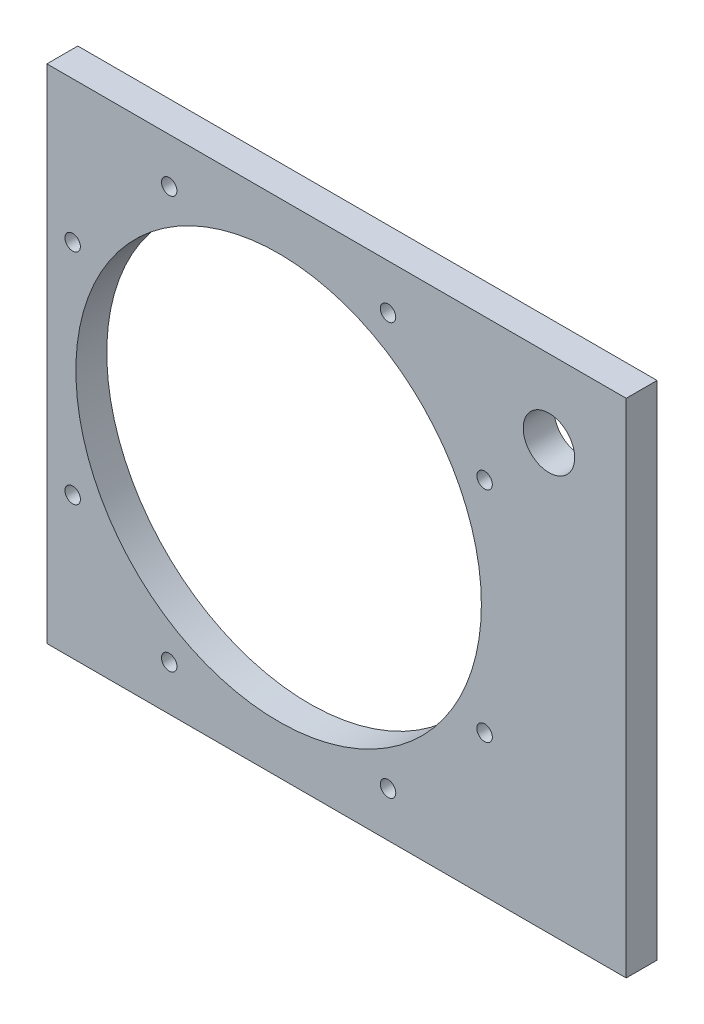
ISO-10303-21;
HEADER;
FILE_DESCRIPTION(('STEP AP214'),'2;1');
FILE_NAME('part.step','',(''),(''),'','','');
FILE_SCHEMA(('AUTOMOTIVE_DESIGN { 1 0 10303 214 1 1 1 1 }'));
ENDSEC;
DATA;
#1=APPLICATION_CONTEXT('core data for automotive mechanical design processes');
#2=APPLICATION_PROTOCOL_DEFINITION('international standard','automotive_design',2000,#1);
#3=PRODUCT_CONTEXT('',#1,'mechanical');
#4=PRODUCT('Part','Part','',(#3));
#5=PRODUCT_RELATED_PRODUCT_CATEGORY('part','',(#4));
#6=PRODUCT_DEFINITION_FORMATION('','',#4);
#7=PRODUCT_DEFINITION_CONTEXT('part definition',#1,'design');
#8=PRODUCT_DEFINITION('design','',#6,#7);
#9=PRODUCT_DEFINITION_SHAPE('','',#8);
#10=(LENGTH_UNIT() NAMED_UNIT(*) SI_UNIT(.MILLI.,.METRE.));
#11=(NAMED_UNIT(*) PLANE_ANGLE_UNIT() SI_UNIT($,.RADIAN.));
#12=(NAMED_UNIT(*) SI_UNIT($,.STERADIAN.) SOLID_ANGLE_UNIT());
#13=UNCERTAINTY_MEASURE_WITH_UNIT(LENGTH_MEASURE(1.E-05),#10,'distance_accuracy_value','');
#14=(GEOMETRIC_REPRESENTATION_CONTEXT(3) GLOBAL_UNCERTAINTY_ASSIGNED_CONTEXT((#13)) GLOBAL_UNIT_ASSIGNED_CONTEXT((#10,
#11,#12)) REPRESENTATION_CONTEXT('',''));
#15=CARTESIAN_POINT('',(0.,0.,0.));
#16=DIRECTION('',(0.,0.,1.));
#17=DIRECTION('',(1.,0.,0.));
#18=AXIS2_PLACEMENT_3D('',#15,#16,#17);
#19=CARTESIAN_POINT('',(0.,0.,24.));
#20=DIRECTION('',(0.,0.,1.));
#21=DIRECTION('',(1.,0.,0.));
#22=AXIS2_PLACEMENT_3D('',#19,#20,#21);
#23=PLANE('',#22);
#24=CARTESIAN_POINT('',(40.0000000000018,-160.,24.));
#25=DIRECTION('',(0.,0.,1.));
#26=DIRECTION('',(-1.,0.,0.));
#27=AXIS2_PLACEMENT_3D('',#24,#25,#26);
#28=CIRCLE('',#27,6.00000000000001);
#29=CARTESIAN_POINT('',(34.0000000000017,-160.,24.));
#30=VERTEX_POINT('',#29);
#31=EDGE_CURVE('E161',#30,#30,#28,.T.);
#32=ORIENTED_EDGE('',*,*,#31,.F.);
#33=EDGE_LOOP('',(#32));
#34=FACE_BOUND('',#33,.T.);
#35=CARTESIAN_POINT('',(115.000000000003,85.0000000000034,24.));
#36=DIRECTION('',(0.,0.,1.));
#37=DIRECTION('',(-1.,0.,0.));
#38=AXIS2_PLACEMENT_3D('',#35,#36,#37);
#39=CIRCLE('',#38,6.);
#40=CARTESIAN_POINT('',(109.000000000003,85.0000000000034,24.));
#41=VERTEX_POINT('',#40);
#42=EDGE_CURVE('E149',#41,#41,#39,.T.);
#43=ORIENTED_EDGE('',*,*,#42,.F.);
#44=EDGE_LOOP('',(#43));
#45=FACE_BOUND('',#44,.T.);
#46=CARTESIAN_POINT('',(-130.000000000001,160.000000000004,24.));
#47=DIRECTION('',(0.,0.,1.));
#48=DIRECTION('',(-1.,0.,0.));
#49=AXIS2_PLACEMENT_3D('',#46,#47,#48);
#50=CIRCLE('',#49,6.00000000000002);
#51=CARTESIAN_POINT('',(-136.000000000001,160.000000000004,24.));
#52=VERTEX_POINT('',#51);
#53=EDGE_CURVE('E137',#52,#52,#50,.T.);
#54=ORIENTED_EDGE('',*,*,#53,.F.);
#55=EDGE_LOOP('',(#54));
#56=FACE_BOUND('',#55,.T.);
#57=CARTESIAN_POINT('',(-205.,-85.0000000000001,24.));
#58=DIRECTION('',(0.,0.,1.));
#59=DIRECTION('',(-1.,0.,0.));
#60=AXIS2_PLACEMENT_3D('',#57,#58,#59);
#61=CIRCLE('',#60,6.00000000000002);
#62=CARTESIAN_POINT('',(-211.,-85.0000000000001,24.));
#63=VERTEX_POINT('',#62);
#64=EDGE_CURVE('E125',#63,#63,#61,.T.);
#65=ORIENTED_EDGE('',*,*,#64,.F.);
#66=EDGE_LOOP('',(#65));
#67=FACE_BOUND('',#66,.T.);
#68=CARTESIAN_POINT('',(-45.,0.,24.));
#69=DIRECTION('',(0.,0.,1.));
#70=DIRECTION('',(1.,0.,0.));
#71=AXIS2_PLACEMENT_3D('',#68,#69,#70);
#72=CIRCLE('',#71,157.5);
#73=CARTESIAN_POINT('',(112.5,0.,24.));
#74=VERTEX_POINT('',#73);
#75=EDGE_CURVE('E104',#74,#74,#72,.T.);
#76=ORIENTED_EDGE('',*,*,#75,.F.);
#77=EDGE_LOOP('',(#76));
#78=FACE_BOUND('',#77,.T.);
#79=DIRECTION('',(0.,1.,0.));
#80=VECTOR('',#79,1.);
#81=CARTESIAN_POINT('',(225.,195.,24.));
#82=LINE('',#81,#80);
#83=CARTESIAN_POINT('',(225.,-195.,24.));
#84=VERTEX_POINT('',#83);
#85=CARTESIAN_POINT('',(225.,195.,24.));
#86=VERTEX_POINT('',#85);
#87=EDGE_CURVE('E89',#84,#86,#82,.T.);
#88=ORIENTED_EDGE('',*,*,#87,.T.);
#89=DIRECTION('',(-1.,0.,0.));
#90=VECTOR('',#89,1.);
#91=CARTESIAN_POINT('',(-225.,195.,24.));
#92=LINE('',#91,#90);
#93=CARTESIAN_POINT('',(-225.,195.,24.));
#94=VERTEX_POINT('',#93);
#95=EDGE_CURVE('E84',#86,#94,#92,.T.);
#96=ORIENTED_EDGE('',*,*,#95,.T.);
#97=DIRECTION('',(0.,-1.,0.));
#98=VECTOR('',#97,1.);
#99=CARTESIAN_POINT('',(-225.,195.,24.));
#100=LINE('',#99,#98);
#101=CARTESIAN_POINT('',(-225.,-195.,24.));
#102=VERTEX_POINT('',#101);
#103=EDGE_CURVE('E87',#94,#102,#100,.T.);
#104=ORIENTED_EDGE('',*,*,#103,.T.);
#105=DIRECTION('',(1.,0.,0.));
#106=VECTOR('',#105,1.);
#107=CARTESIAN_POINT('',(-225.,-195.,24.));
#108=LINE('',#107,#106);
#109=EDGE_CURVE('E54',#102,#84,#108,.T.);
#110=ORIENTED_EDGE('',*,*,#109,.T.);
#111=EDGE_LOOP('',(#88,#96,#104,#110));
#112=FACE_BOUND('',#111,.T.);
#113=CARTESIAN_POINT('',(-205.,85.,24.));
#114=DIRECTION('',(0.,0.,1.));
#115=DIRECTION('',(1.,0.,0.));
#116=AXIS2_PLACEMENT_3D('',#113,#114,#115);
#117=CIRCLE('',#116,6.00000000000002);
#118=CARTESIAN_POINT('',(-199.,85.,24.));
#119=VERTEX_POINT('',#118);
#120=EDGE_CURVE('E119',#119,#119,#117,.T.);
#121=ORIENTED_EDGE('',*,*,#120,.F.);
#122=EDGE_LOOP('',(#121));
#123=FACE_BOUND('',#122,.T.);
#124=CARTESIAN_POINT('',(39.9999999999996,160.000000000003,24.));
#125=DIRECTION('',(0.,0.,1.));
#126=DIRECTION('',(1.,0.,0.));
#127=AXIS2_PLACEMENT_3D('',#124,#125,#126);
#128=CIRCLE('',#127,6.00000000000001);
#129=CARTESIAN_POINT('',(45.9999999999996,160.000000000003,24.));
#130=VERTEX_POINT('',#129);
#131=EDGE_CURVE('E131',#130,#130,#128,.T.);
#132=ORIENTED_EDGE('',*,*,#131,.F.);
#133=EDGE_LOOP('',(#132));
#134=FACE_BOUND('',#133,.T.);
#135=CARTESIAN_POINT('',(115.000000000002,-84.9999999999968,24.));
#136=DIRECTION('',(0.,0.,1.));
#137=DIRECTION('',(1.,0.,0.));
#138=AXIS2_PLACEMENT_3D('',#135,#136,#137);
#139=CIRCLE('',#138,6.00000000000003);
#140=CARTESIAN_POINT('',(121.000000000002,-84.9999999999968,24.));
#141=VERTEX_POINT('',#140);
#142=EDGE_CURVE('E143',#141,#141,#139,.T.);
#143=ORIENTED_EDGE('',*,*,#142,.F.);
#144=EDGE_LOOP('',(#143));
#145=FACE_BOUND('',#144,.T.);
#146=CARTESIAN_POINT('',(-129.999999999998,-159.999999999998,24.));
#147=DIRECTION('',(0.,0.,1.));
#148=DIRECTION('',(1.,0.,0.));
#149=AXIS2_PLACEMENT_3D('',#146,#147,#148);
#150=CIRCLE('',#149,6.00000000000002);
#151=CARTESIAN_POINT('',(-123.999999999998,-159.999999999998,24.));
#152=VERTEX_POINT('',#151);
#153=EDGE_CURVE('E155',#152,#152,#150,.T.);
#154=ORIENTED_EDGE('',*,*,#153,.F.);
#155=EDGE_LOOP('',(#154));
#156=FACE_BOUND('',#155,.T.);
#157=CARTESIAN_POINT('',(165.,135.,24.));
#158=DIRECTION('',(0.,0.,1.));
#159=DIRECTION('',(1.,0.,0.));
#160=AXIS2_PLACEMENT_3D('',#157,#158,#159);
#161=CIRCLE('',#160,20.);
#162=CARTESIAN_POINT('',(185.,135.,24.));
#163=VERTEX_POINT('',#162);
#164=EDGE_CURVE('E167',#163,#163,#161,.T.);
#165=ORIENTED_EDGE('',*,*,#164,.F.);
#166=EDGE_LOOP('',(#165));
#167=FACE_BOUND('',#166,.T.);
#168=ADVANCED_FACE('F37',(#34,#45,#56,#67,#78,#112,#123,#134,#145,#156,#167),#23,.T.);
#169=CARTESIAN_POINT('',(0.,0.,0.));
#170=DIRECTION('',(0.,0.,1.));
#171=DIRECTION('',(1.,0.,0.));
#172=AXIS2_PLACEMENT_3D('',#169,#170,#171);
#173=PLANE('',#172);
#174=DIRECTION('',(0.,1.,0.));
#175=VECTOR('',#174,1.);
#176=CARTESIAN_POINT('',(225.,195.,0.));
#177=LINE('',#176,#175);
#178=CARTESIAN_POINT('',(225.,-195.,0.));
#179=VERTEX_POINT('',#178);
#180=CARTESIAN_POINT('',(225.,195.,0.));
#181=VERTEX_POINT('',#180);
#182=EDGE_CURVE('E101',#179,#181,#177,.T.);
#183=ORIENTED_EDGE('',*,*,#182,.F.);
#184=DIRECTION('',(1.,0.,0.));
#185=VECTOR('',#184,1.);
#186=CARTESIAN_POINT('',(-225.,-195.,0.));
#187=LINE('',#186,#185);
#188=CARTESIAN_POINT('',(-225.,-195.,0.));
#189=VERTEX_POINT('',#188);
#190=EDGE_CURVE('E77',#189,#179,#187,.T.);
#191=ORIENTED_EDGE('',*,*,#190,.F.);
#192=DIRECTION('',(0.,-1.,0.));
#193=VECTOR('',#192,1.);
#194=CARTESIAN_POINT('',(-225.,195.,0.));
#195=LINE('',#194,#193);
#196=CARTESIAN_POINT('',(-225.,195.,0.));
#197=VERTEX_POINT('',#196);
#198=EDGE_CURVE('E71',#197,#189,#195,.T.);
#199=ORIENTED_EDGE('',*,*,#198,.F.);
#200=DIRECTION('',(-1.,0.,0.));
#201=VECTOR('',#200,1.);
#202=CARTESIAN_POINT('',(-225.,195.,0.));
#203=LINE('',#202,#201);
#204=EDGE_CURVE('E93',#181,#197,#203,.T.);
#205=ORIENTED_EDGE('',*,*,#204,.F.);
#206=EDGE_LOOP('',(#183,#191,#199,#205));
#207=FACE_BOUND('',#206,.T.);
#208=CARTESIAN_POINT('',(-45.,0.,0.));
#209=DIRECTION('',(0.,0.,1.));
#210=DIRECTION('',(1.,0.,0.));
#211=AXIS2_PLACEMENT_3D('',#208,#209,#210);
#212=CIRCLE('',#211,157.5);
#213=CARTESIAN_POINT('',(112.5,0.,0.));
#214=VERTEX_POINT('',#213);
#215=EDGE_CURVE('E116',#214,#214,#212,.T.);
#216=ORIENTED_EDGE('',*,*,#215,.T.);
#217=EDGE_LOOP('',(#216));
#218=FACE_BOUND('',#217,.T.);
#219=CARTESIAN_POINT('',(-205.,85.,0.));
#220=DIRECTION('',(0.,0.,1.));
#221=DIRECTION('',(1.,0.,0.));
#222=AXIS2_PLACEMENT_3D('',#219,#220,#221);
#223=CIRCLE('',#222,6.00000000000002);
#224=CARTESIAN_POINT('',(-199.,85.,0.));
#225=VERTEX_POINT('',#224);
#226=EDGE_CURVE('E122',#225,#225,#223,.T.);
#227=ORIENTED_EDGE('',*,*,#226,.T.);
#228=EDGE_LOOP('',(#227));
#229=FACE_BOUND('',#228,.T.);
#230=CARTESIAN_POINT('',(-205.,-85.0000000000001,0.));
#231=DIRECTION('',(0.,0.,1.));
#232=DIRECTION('',(-1.,0.,0.));
#233=AXIS2_PLACEMENT_3D('',#230,#231,#232);
#234=CIRCLE('',#233,6.00000000000002);
#235=CARTESIAN_POINT('',(-211.,-85.0000000000001,0.));
#236=VERTEX_POINT('',#235);
#237=EDGE_CURVE('E128',#236,#236,#234,.T.);
#238=ORIENTED_EDGE('',*,*,#237,.T.);
#239=EDGE_LOOP('',(#238));
#240=FACE_BOUND('',#239,.T.);
#241=CARTESIAN_POINT('',(39.9999999999996,160.000000000003,0.));
#242=DIRECTION('',(0.,0.,1.));
#243=DIRECTION('',(1.,0.,0.));
#244=AXIS2_PLACEMENT_3D('',#241,#242,#243);
#245=CIRCLE('',#244,6.00000000000001);
#246=CARTESIAN_POINT('',(45.9999999999996,160.000000000003,0.));
#247=VERTEX_POINT('',#246);
#248=EDGE_CURVE('E134',#247,#247,#245,.T.);
#249=ORIENTED_EDGE('',*,*,#248,.T.);
#250=EDGE_LOOP('',(#249));
#251=FACE_BOUND('',#250,.T.);
#252=CARTESIAN_POINT('',(-130.000000000001,160.000000000004,0.));
#253=DIRECTION('',(0.,0.,1.));
#254=DIRECTION('',(-1.,0.,0.));
#255=AXIS2_PLACEMENT_3D('',#252,#253,#254);
#256=CIRCLE('',#255,6.00000000000002);
#257=CARTESIAN_POINT('',(-136.000000000001,160.000000000004,0.));
#258=VERTEX_POINT('',#257);
#259=EDGE_CURVE('E140',#258,#258,#256,.T.);
#260=ORIENTED_EDGE('',*,*,#259,.T.);
#261=EDGE_LOOP('',(#260));
#262=FACE_BOUND('',#261,.T.);
#263=CARTESIAN_POINT('',(115.000000000002,-84.9999999999968,0.));
#264=DIRECTION('',(0.,0.,1.));
#265=DIRECTION('',(1.,0.,0.));
#266=AXIS2_PLACEMENT_3D('',#263,#264,#265);
#267=CIRCLE('',#266,6.00000000000003);
#268=CARTESIAN_POINT('',(121.000000000002,-84.9999999999968,0.));
#269=VERTEX_POINT('',#268);
#270=EDGE_CURVE('E146',#269,#269,#267,.T.);
#271=ORIENTED_EDGE('',*,*,#270,.T.);
#272=EDGE_LOOP('',(#271));
#273=FACE_BOUND('',#272,.T.);
#274=CARTESIAN_POINT('',(115.000000000003,85.0000000000034,0.));
#275=DIRECTION('',(0.,0.,1.));
#276=DIRECTION('',(-1.,0.,0.));
#277=AXIS2_PLACEMENT_3D('',#274,#275,#276);
#278=CIRCLE('',#277,6.);
#279=CARTESIAN_POINT('',(109.000000000003,85.0000000000034,0.));
#280=VERTEX_POINT('',#279);
#281=EDGE_CURVE('E152',#280,#280,#278,.T.);
#282=ORIENTED_EDGE('',*,*,#281,.T.);
#283=EDGE_LOOP('',(#282));
#284=FACE_BOUND('',#283,.T.);
#285=CARTESIAN_POINT('',(-129.999999999998,-159.999999999998,0.));
#286=DIRECTION('',(0.,0.,1.));
#287=DIRECTION('',(1.,0.,0.));
#288=AXIS2_PLACEMENT_3D('',#285,#286,#287);
#289=CIRCLE('',#288,6.00000000000002);
#290=CARTESIAN_POINT('',(-123.999999999998,-159.999999999998,0.));
#291=VERTEX_POINT('',#290);
#292=EDGE_CURVE('E158',#291,#291,#289,.T.);
#293=ORIENTED_EDGE('',*,*,#292,.T.);
#294=EDGE_LOOP('',(#293));
#295=FACE_BOUND('',#294,.T.);
#296=CARTESIAN_POINT('',(40.0000000000018,-160.,0.));
#297=DIRECTION('',(0.,0.,1.));
#298=DIRECTION('',(-1.,0.,0.));
#299=AXIS2_PLACEMENT_3D('',#296,#297,#298);
#300=CIRCLE('',#299,6.00000000000001);
#301=CARTESIAN_POINT('',(34.0000000000017,-160.,0.));
#302=VERTEX_POINT('',#301);
#303=EDGE_CURVE('E164',#302,#302,#300,.T.);
#304=ORIENTED_EDGE('',*,*,#303,.T.);
#305=EDGE_LOOP('',(#304));
#306=FACE_BOUND('',#305,.T.);
#307=CARTESIAN_POINT('',(165.,135.,0.));
#308=DIRECTION('',(0.,0.,1.));
#309=DIRECTION('',(1.,0.,0.));
#310=AXIS2_PLACEMENT_3D('',#307,#308,#309);
#311=CIRCLE('',#310,20.);
#312=CARTESIAN_POINT('',(185.,135.,0.));
#313=VERTEX_POINT('',#312);
#314=EDGE_CURVE('E170',#313,#313,#311,.T.);
#315=ORIENTED_EDGE('',*,*,#314,.T.);
#316=EDGE_LOOP('',(#315));
#317=FACE_BOUND('',#316,.T.);
#318=ADVANCED_FACE('F112',(#207,#218,#229,#240,#251,#262,#273,#284,#295,#306,#317),#173,.F.);
#319=CARTESIAN_POINT('',(225.,195.,24.));
#320=DIRECTION('',(-1.,0.,0.));
#321=DIRECTION('',(0.,-1.,0.));
#322=AXIS2_PLACEMENT_3D('',#319,#320,#321);
#323=PLANE('',#322);
#324=ORIENTED_EDGE('',*,*,#182,.T.);
#325=DIRECTION('',(0.,0.,-1.));
#326=VECTOR('',#325,1.);
#327=CARTESIAN_POINT('',(225.,195.,24.));
#328=LINE('',#327,#326);
#329=EDGE_CURVE('E11',#86,#181,#328,.T.);
#330=ORIENTED_EDGE('',*,*,#329,.F.);
#331=ORIENTED_EDGE('',*,*,#87,.F.);
#332=DIRECTION('',(0.,0.,-1.));
#333=VECTOR('',#332,1.);
#334=CARTESIAN_POINT('',(225.,-195.,24.));
#335=LINE('',#334,#333);
#336=EDGE_CURVE('E97',#84,#179,#335,.T.);
#337=ORIENTED_EDGE('',*,*,#336,.T.);
#338=EDGE_LOOP('',(#324,#330,#331,#337));
#339=FACE_BOUND('',#338,.T.);
#340=ADVANCED_FACE('F39',(#339),#323,.F.);
#341=CARTESIAN_POINT('',(-225.,195.,24.));
#342=DIRECTION('',(0.,-1.,0.));
#343=DIRECTION('',(0.,0.,-1.));
#344=AXIS2_PLACEMENT_3D('',#341,#342,#343);
#345=PLANE('',#344);
#346=ORIENTED_EDGE('',*,*,#204,.T.);
#347=DIRECTION('',(0.,0.,-1.));
#348=VECTOR('',#347,1.);
#349=CARTESIAN_POINT('',(-225.,195.,24.));
#350=LINE('',#349,#348);
#351=EDGE_CURVE('E46',#94,#197,#350,.T.);
#352=ORIENTED_EDGE('',*,*,#351,.F.);
#353=ORIENTED_EDGE('',*,*,#95,.F.);
#354=ORIENTED_EDGE('',*,*,#329,.T.);
#355=EDGE_LOOP('',(#346,#352,#353,#354));
#356=FACE_BOUND('',#355,.T.);
#357=ADVANCED_FACE('F92',(#356),#345,.F.);
#358=CARTESIAN_POINT('',(-225.,195.,24.));
#359=DIRECTION('',(1.,0.,0.));
#360=DIRECTION('',(0.,1.,0.));
#361=AXIS2_PLACEMENT_3D('',#358,#359,#360);
#362=PLANE('',#361);
#363=ORIENTED_EDGE('',*,*,#198,.T.);
#364=DIRECTION('',(0.,0.,-1.));
#365=VECTOR('',#364,1.);
#366=CARTESIAN_POINT('',(-225.,-195.,24.));
#367=LINE('',#366,#365);
#368=EDGE_CURVE('E94',#102,#189,#367,.T.);
#369=ORIENTED_EDGE('',*,*,#368,.F.);
#370=ORIENTED_EDGE('',*,*,#103,.F.);
#371=ORIENTED_EDGE('',*,*,#351,.T.);
#372=EDGE_LOOP('',(#363,#369,#370,#371));
#373=FACE_BOUND('',#372,.T.);
#374=ADVANCED_FACE('F95',(#373),#362,.F.);
#375=CARTESIAN_POINT('',(-225.,-195.,24.));
#376=DIRECTION('',(0.,1.,0.));
#377=DIRECTION('',(0.,0.,1.));
#378=AXIS2_PLACEMENT_3D('',#375,#376,#377);
#379=PLANE('',#378);
#380=ORIENTED_EDGE('',*,*,#190,.T.);
#381=ORIENTED_EDGE('',*,*,#336,.F.);
#382=ORIENTED_EDGE('',*,*,#109,.F.);
#383=ORIENTED_EDGE('',*,*,#368,.T.);
#384=EDGE_LOOP('',(#380,#381,#382,#383));
#385=FACE_BOUND('',#384,.T.);
#386=ADVANCED_FACE('F109',(#385),#379,.F.);
#387=CARTESIAN_POINT('',(-45.,0.,24.));
#388=DIRECTION('',(0.,0.,-1.));
#389=DIRECTION('',(-1.,0.,0.));
#390=AXIS2_PLACEMENT_3D('',#387,#388,#389);
#391=CYLINDRICAL_SURFACE('',#390,157.5);
#392=ORIENTED_EDGE('',*,*,#75,.T.);
#393=EDGE_LOOP('',(#392));
#394=FACE_BOUND('',#393,.T.);
#395=ORIENTED_EDGE('',*,*,#215,.F.);
#396=EDGE_LOOP('',(#395));
#397=FACE_BOUND('',#396,.T.);
#398=ADVANCED_FACE('F189',(#394,#397),#391,.F.);
#399=CARTESIAN_POINT('',(-205.,85.,24.));
#400=DIRECTION('',(0.,0.,-1.));
#401=DIRECTION('',(-1.,0.,0.));
#402=AXIS2_PLACEMENT_3D('',#399,#400,#401);
#403=CYLINDRICAL_SURFACE('',#402,6.00000000000002);
#404=ORIENTED_EDGE('',*,*,#120,.T.);
#405=EDGE_LOOP('',(#404));
#406=FACE_BOUND('',#405,.T.);
#407=ORIENTED_EDGE('',*,*,#226,.F.);
#408=EDGE_LOOP('',(#407));
#409=FACE_BOUND('',#408,.T.);
#410=ADVANCED_FACE('F235',(#406,#409),#403,.F.);
#411=CARTESIAN_POINT('',(-205.,-85.0000000000001,24.));
#412=DIRECTION('',(0.,0.,-1.));
#413=DIRECTION('',(-1.,0.,0.));
#414=AXIS2_PLACEMENT_3D('',#411,#412,#413);
#415=CYLINDRICAL_SURFACE('',#414,6.00000000000002);
#416=ORIENTED_EDGE('',*,*,#64,.T.);
#417=EDGE_LOOP('',(#416));
#418=FACE_BOUND('',#417,.T.);
#419=ORIENTED_EDGE('',*,*,#237,.F.);
#420=EDGE_LOOP('',(#419));
#421=FACE_BOUND('',#420,.T.);
#422=ADVANCED_FACE('F243',(#418,#421),#415,.F.);
#423=CARTESIAN_POINT('',(39.9999999999996,160.000000000003,24.));
#424=DIRECTION('',(0.,0.,-1.));
#425=DIRECTION('',(-1.,0.,0.));
#426=AXIS2_PLACEMENT_3D('',#423,#424,#425);
#427=CYLINDRICAL_SURFACE('',#426,6.00000000000001);
#428=ORIENTED_EDGE('',*,*,#131,.T.);
#429=EDGE_LOOP('',(#428));
#430=FACE_BOUND('',#429,.T.);
#431=ORIENTED_EDGE('',*,*,#248,.F.);
#432=EDGE_LOOP('',(#431));
#433=FACE_BOUND('',#432,.T.);
#434=ADVANCED_FACE('F251',(#430,#433),#427,.F.);
#435=CARTESIAN_POINT('',(-130.000000000001,160.000000000004,24.));
#436=DIRECTION('',(0.,0.,-1.));
#437=DIRECTION('',(-1.,0.,0.));
#438=AXIS2_PLACEMENT_3D('',#435,#436,#437);
#439=CYLINDRICAL_SURFACE('',#438,6.00000000000002);
#440=ORIENTED_EDGE('',*,*,#53,.T.);
#441=EDGE_LOOP('',(#440));
#442=FACE_BOUND('',#441,.T.);
#443=ORIENTED_EDGE('',*,*,#259,.F.);
#444=EDGE_LOOP('',(#443));
#445=FACE_BOUND('',#444,.T.);
#446=ADVANCED_FACE('F260',(#442,#445),#439,.F.);
#447=CARTESIAN_POINT('',(115.000000000002,-84.9999999999968,24.));
#448=DIRECTION('',(0.,0.,-1.));
#449=DIRECTION('',(-1.,0.,0.));
#450=AXIS2_PLACEMENT_3D('',#447,#448,#449);
#451=CYLINDRICAL_SURFACE('',#450,6.00000000000003);
#452=ORIENTED_EDGE('',*,*,#142,.T.);
#453=EDGE_LOOP('',(#452));
#454=FACE_BOUND('',#453,.T.);
#455=ORIENTED_EDGE('',*,*,#270,.F.);
#456=EDGE_LOOP('',(#455));
#457=FACE_BOUND('',#456,.T.);
#458=ADVANCED_FACE('F269',(#454,#457),#451,.F.);
#459=CARTESIAN_POINT('',(115.000000000003,85.0000000000034,24.));
#460=DIRECTION('',(0.,0.,-1.));
#461=DIRECTION('',(-1.,0.,0.));
#462=AXIS2_PLACEMENT_3D('',#459,#460,#461);
#463=CYLINDRICAL_SURFACE('',#462,6.);
#464=ORIENTED_EDGE('',*,*,#42,.T.);
#465=EDGE_LOOP('',(#464));
#466=FACE_BOUND('',#465,.T.);
#467=ORIENTED_EDGE('',*,*,#281,.F.);
#468=EDGE_LOOP('',(#467));
#469=FACE_BOUND('',#468,.T.);
#470=ADVANCED_FACE('F278',(#466,#469),#463,.F.);
#471=CARTESIAN_POINT('',(-129.999999999998,-159.999999999998,24.));
#472=DIRECTION('',(0.,0.,-1.));
#473=DIRECTION('',(-1.,0.,0.));
#474=AXIS2_PLACEMENT_3D('',#471,#472,#473);
#475=CYLINDRICAL_SURFACE('',#474,6.00000000000002);
#476=ORIENTED_EDGE('',*,*,#153,.T.);
#477=EDGE_LOOP('',(#476));
#478=FACE_BOUND('',#477,.T.);
#479=ORIENTED_EDGE('',*,*,#292,.F.);
#480=EDGE_LOOP('',(#479));
#481=FACE_BOUND('',#480,.T.);
#482=ADVANCED_FACE('F287',(#478,#481),#475,.F.);
#483=CARTESIAN_POINT('',(40.0000000000018,-160.,24.));
#484=DIRECTION('',(0.,0.,-1.));
#485=DIRECTION('',(-1.,0.,0.));
#486=AXIS2_PLACEMENT_3D('',#483,#484,#485);
#487=CYLINDRICAL_SURFACE('',#486,6.00000000000001);
#488=ORIENTED_EDGE('',*,*,#31,.T.);
#489=EDGE_LOOP('',(#488));
#490=FACE_BOUND('',#489,.T.);
#491=ORIENTED_EDGE('',*,*,#303,.F.);
#492=EDGE_LOOP('',(#491));
#493=FACE_BOUND('',#492,.T.);
#494=ADVANCED_FACE('F296',(#490,#493),#487,.F.);
#495=CARTESIAN_POINT('',(165.,135.,24.));
#496=DIRECTION('',(0.,0.,-1.));
#497=DIRECTION('',(-1.,0.,0.));
#498=AXIS2_PLACEMENT_3D('',#495,#496,#497);
#499=CYLINDRICAL_SURFACE('',#498,20.);
#500=ORIENTED_EDGE('',*,*,#164,.T.);
#501=EDGE_LOOP('',(#500));
#502=FACE_BOUND('',#501,.T.);
#503=ORIENTED_EDGE('',*,*,#314,.F.);
#504=EDGE_LOOP('',(#503));
#505=FACE_BOUND('',#504,.T.);
#506=ADVANCED_FACE('F176',(#502,#505),#499,.F.);
#507=CLOSED_SHELL('',(#168,#318,#340,#357,#374,#386,#398,#410,#422,#434,#446,#458,#470,#482,
#494,#506));
#508=MANIFOLD_SOLID_BREP('B2',#507);
#509=ADVANCED_BREP_SHAPE_REPRESENTATION('',(#18,#508),#14);
#510=SHAPE_DEFINITION_REPRESENTATION(#9,#509);
ENDSEC;
END-ISO-10303-21;
